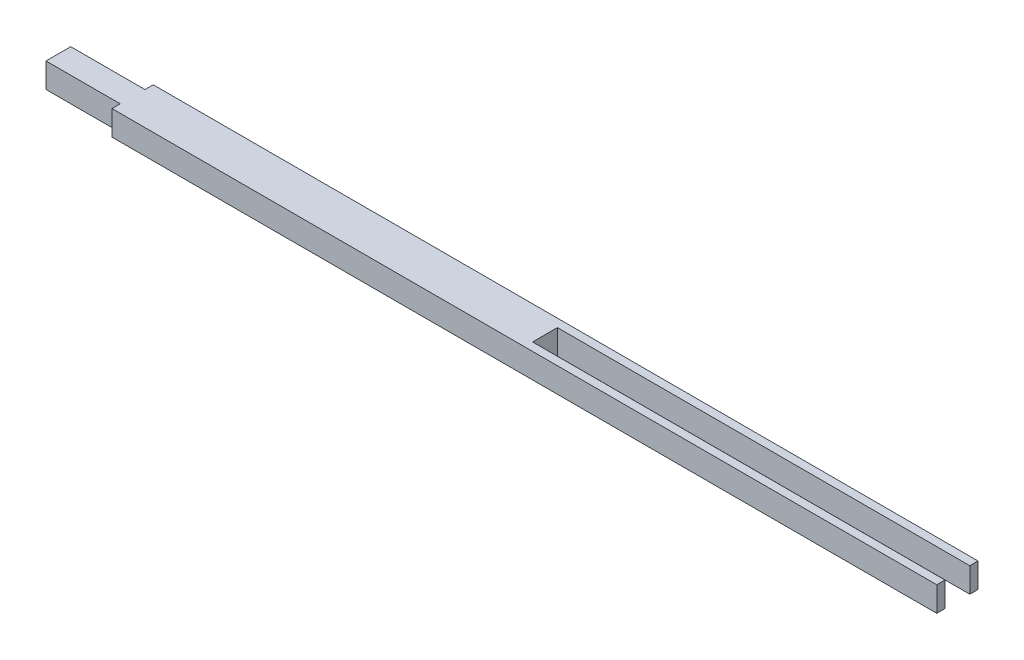
ISO-10303-21;
HEADER;
FILE_DESCRIPTION(('STEP AP214'),'2;1');
FILE_NAME('part.step','',(''),(''),'','','');
FILE_SCHEMA(('AUTOMOTIVE_DESIGN { 1 0 10303 214 1 1 1 1 }'));
ENDSEC;
DATA;
#1=APPLICATION_CONTEXT('core data for automotive mechanical design processes');
#2=APPLICATION_PROTOCOL_DEFINITION('international standard','automotive_design',2000,#1);
#3=PRODUCT_CONTEXT('',#1,'mechanical');
#4=PRODUCT('Part','Part','',(#3));
#5=PRODUCT_RELATED_PRODUCT_CATEGORY('part','',(#4));
#6=PRODUCT_DEFINITION_FORMATION('','',#4);
#7=PRODUCT_DEFINITION_CONTEXT('part definition',#1,'design');
#8=PRODUCT_DEFINITION('design','',#6,#7);
#9=PRODUCT_DEFINITION_SHAPE('','',#8);
#10=(LENGTH_UNIT() NAMED_UNIT(*) SI_UNIT(.MILLI.,.METRE.));
#11=(NAMED_UNIT(*) PLANE_ANGLE_UNIT() SI_UNIT($,.RADIAN.));
#12=(NAMED_UNIT(*) SI_UNIT($,.STERADIAN.) SOLID_ANGLE_UNIT());
#13=UNCERTAINTY_MEASURE_WITH_UNIT(LENGTH_MEASURE(1.E-05),#10,'distance_accuracy_value','');
#14=(GEOMETRIC_REPRESENTATION_CONTEXT(3) GLOBAL_UNCERTAINTY_ASSIGNED_CONTEXT((#13)) GLOBAL_UNIT_ASSIGNED_CONTEXT((#10,
#11,#12)) REPRESENTATION_CONTEXT('',''));
#15=CARTESIAN_POINT('',(0.,0.,0.));
#16=DIRECTION('',(0.,0.,1.));
#17=DIRECTION('',(1.,0.,0.));
#18=AXIS2_PLACEMENT_3D('',#15,#16,#17);
#19=CARTESIAN_POINT('',(-50.,3.,2.5));
#20=DIRECTION('',(1.,0.,0.));
#21=DIRECTION('',(0.,0.,-1.));
#22=AXIS2_PLACEMENT_3D('',#19,#20,#21);
#23=PLANE('',#22);
#24=DIRECTION('',(0.,0.,1.));
#25=VECTOR('',#24,1.);
#26=CARTESIAN_POINT('',(-50.,3.,2.5));
#27=LINE('',#26,#25);
#28=CARTESIAN_POINT('',(-50.,3.,1.5));
#29=VERTEX_POINT('',#28);
#30=CARTESIAN_POINT('',(-50.,3.,2.5));
#31=VERTEX_POINT('',#30);
#32=EDGE_CURVE('E189',#29,#31,#27,.T.);
#33=ORIENTED_EDGE('',*,*,#32,.F.);
#34=DIRECTION('',(0.,-1.,0.));
#35=VECTOR('',#34,1.);
#36=CARTESIAN_POINT('',(-50.,3.,1.5));
#37=LINE('',#36,#35);
#38=CARTESIAN_POINT('',(-50.,0.,1.5));
#39=VERTEX_POINT('',#38);
#40=EDGE_CURVE('E155',#29,#39,#37,.T.);
#41=ORIENTED_EDGE('',*,*,#40,.T.);
#42=DIRECTION('',(0.,0.,1.));
#43=VECTOR('',#42,1.);
#44=CARTESIAN_POINT('',(-50.,0.,2.5));
#45=LINE('',#44,#43);
#46=CARTESIAN_POINT('',(-50.,0.,2.5));
#47=VERTEX_POINT('',#46);
#48=EDGE_CURVE('E201',#39,#47,#45,.T.);
#49=ORIENTED_EDGE('',*,*,#48,.T.);
#50=DIRECTION('',(0.,-1.,0.));
#51=VECTOR('',#50,1.);
#52=CARTESIAN_POINT('',(-50.,3.,2.5));
#53=LINE('',#52,#51);
#54=EDGE_CURVE('E208',#31,#47,#53,.T.);
#55=ORIENTED_EDGE('',*,*,#54,.F.);
#56=EDGE_LOOP('',(#33,#41,#49,#55));
#57=FACE_BOUND('',#56,.T.);
#58=ADVANCED_FACE('F33',(#57),#23,.F.);
#59=CARTESIAN_POINT('',(50.,3.,2.5));
#60=DIRECTION('',(-1.,0.,0.));
#61=DIRECTION('',(0.,0.,1.));
#62=AXIS2_PLACEMENT_3D('',#59,#60,#61);
#63=PLANE('',#62);
#64=DIRECTION('',(0.,0.,-1.));
#65=VECTOR('',#64,1.);
#66=CARTESIAN_POINT('',(50.,0.,2.5));
#67=LINE('',#66,#65);
#68=CARTESIAN_POINT('',(50.,0.,2.5));
#69=VERTEX_POINT('',#68);
#70=CARTESIAN_POINT('',(50.,0.,1.50499999999999));
#71=VERTEX_POINT('',#70);
#72=EDGE_CURVE('E196',#69,#71,#67,.T.);
#73=ORIENTED_EDGE('',*,*,#72,.T.);
#74=DIRECTION('',(0.,1.,0.));
#75=VECTOR('',#74,1.);
#76=CARTESIAN_POINT('',(50.,0.,1.50499999999999));
#77=LINE('',#76,#75);
#78=CARTESIAN_POINT('',(50.,3.,1.50499999999999));
#79=VERTEX_POINT('',#78);
#80=EDGE_CURVE('E174',#71,#79,#77,.T.);
#81=ORIENTED_EDGE('',*,*,#80,.T.);
#82=DIRECTION('',(0.,0.,-1.));
#83=VECTOR('',#82,1.);
#84=CARTESIAN_POINT('',(50.,3.,2.5));
#85=LINE('',#84,#83);
#86=CARTESIAN_POINT('',(50.,3.,2.5));
#87=VERTEX_POINT('',#86);
#88=EDGE_CURVE('E183',#87,#79,#85,.T.);
#89=ORIENTED_EDGE('',*,*,#88,.F.);
#90=DIRECTION('',(0.,-1.,0.));
#91=VECTOR('',#90,1.);
#92=CARTESIAN_POINT('',(50.,3.,2.5));
#93=LINE('',#92,#91);
#94=EDGE_CURVE('E195',#87,#69,#93,.T.);
#95=ORIENTED_EDGE('',*,*,#94,.T.);
#96=EDGE_LOOP('',(#73,#81,#89,#95));
#97=FACE_BOUND('',#96,.T.);
#98=ADVANCED_FACE('F236',(#97),#63,.F.);
#99=CARTESIAN_POINT('',(50.,3.,-1.50499999999999));
#100=VERTEX_POINT('',#99);
#101=CARTESIAN_POINT('',(50.,3.,-2.5));
#102=VERTEX_POINT('',#101);
#103=EDGE_CURVE('E187',#100,#102,#85,.T.);
#104=ORIENTED_EDGE('',*,*,#103,.F.);
#105=DIRECTION('',(0.,1.,0.));
#106=VECTOR('',#105,1.);
#107=CARTESIAN_POINT('',(50.,0.,-1.50499999999999));
#108=LINE('',#107,#106);
#109=CARTESIAN_POINT('',(50.,0.,-1.50499999999999));
#110=VERTEX_POINT('',#109);
#111=EDGE_CURVE('E167',#110,#100,#108,.T.);
#112=ORIENTED_EDGE('',*,*,#111,.F.);
#113=CARTESIAN_POINT('',(50.,0.,-2.5));
#114=VERTEX_POINT('',#113);
#115=EDGE_CURVE('E177',#110,#114,#67,.T.);
#116=ORIENTED_EDGE('',*,*,#115,.T.);
#117=DIRECTION('',(0.,-1.,0.));
#118=VECTOR('',#117,1.);
#119=CARTESIAN_POINT('',(50.,3.,-2.5));
#120=LINE('',#119,#118);
#121=EDGE_CURVE('E11',#102,#114,#120,.T.);
#122=ORIENTED_EDGE('',*,*,#121,.F.);
#123=EDGE_LOOP('',(#104,#112,#116,#122));
#124=FACE_BOUND('',#123,.T.);
#125=ADVANCED_FACE('F35',(#124),#63,.F.);
#126=CARTESIAN_POINT('',(-50.,3.,-2.5));
#127=DIRECTION('',(0.,0.,1.));
#128=DIRECTION('',(1.,0.,0.));
#129=AXIS2_PLACEMENT_3D('',#126,#127,#128);
#130=PLANE('',#129);
#131=DIRECTION('',(-1.,0.,0.));
#132=VECTOR('',#131,1.);
#133=CARTESIAN_POINT('',(-50.,0.,-2.5));
#134=LINE('',#133,#132);
#135=CARTESIAN_POINT('',(-50.,0.,-2.5));
#136=VERTEX_POINT('',#135);
#137=EDGE_CURVE('E199',#114,#136,#134,.T.);
#138=ORIENTED_EDGE('',*,*,#137,.T.);
#139=DIRECTION('',(0.,-1.,0.));
#140=VECTOR('',#139,1.);
#141=CARTESIAN_POINT('',(-50.,3.,-2.5));
#142=LINE('',#141,#140);
#143=CARTESIAN_POINT('',(-50.,3.,-2.5));
#144=VERTEX_POINT('',#143);
#145=EDGE_CURVE('E41',#144,#136,#142,.T.);
#146=ORIENTED_EDGE('',*,*,#145,.F.);
#147=DIRECTION('',(-1.,0.,0.));
#148=VECTOR('',#147,1.);
#149=CARTESIAN_POINT('',(-50.,3.,-2.5));
#150=LINE('',#149,#148);
#151=EDGE_CURVE('E186',#102,#144,#150,.T.);
#152=ORIENTED_EDGE('',*,*,#151,.F.);
#153=ORIENTED_EDGE('',*,*,#121,.T.);
#154=EDGE_LOOP('',(#138,#146,#152,#153));
#155=FACE_BOUND('',#154,.T.);
#156=ADVANCED_FACE('F220',(#155),#130,.F.);
#157=CARTESIAN_POINT('',(-50.,0.,-1.5));
#158=VERTEX_POINT('',#157);
#159=EDGE_CURVE('E202',#136,#158,#45,.T.);
#160=ORIENTED_EDGE('',*,*,#159,.T.);
#161=DIRECTION('',(0.,1.,0.));
#162=VECTOR('',#161,1.);
#163=CARTESIAN_POINT('',(-50.,3.,-1.5));
#164=LINE('',#163,#162);
#165=CARTESIAN_POINT('',(-50.,3.,-1.5));
#166=VERTEX_POINT('',#165);
#167=EDGE_CURVE('E129',#158,#166,#164,.T.);
#168=ORIENTED_EDGE('',*,*,#167,.T.);
#169=EDGE_CURVE('E190',#144,#166,#27,.T.);
#170=ORIENTED_EDGE('',*,*,#169,.F.);
#171=ORIENTED_EDGE('',*,*,#145,.T.);
#172=EDGE_LOOP('',(#160,#168,#170,#171));
#173=FACE_BOUND('',#172,.T.);
#174=ADVANCED_FACE('F214',(#173),#23,.F.);
#175=CARTESIAN_POINT('',(-50.,3.,2.5));
#176=DIRECTION('',(0.,0.,-1.));
#177=DIRECTION('',(-1.,0.,0.));
#178=AXIS2_PLACEMENT_3D('',#175,#176,#177);
#179=PLANE('',#178);
#180=DIRECTION('',(1.,0.,0.));
#181=VECTOR('',#180,1.);
#182=CARTESIAN_POINT('',(-50.,0.,2.5));
#183=LINE('',#182,#181);
#184=EDGE_CURVE('E204',#47,#69,#183,.T.);
#185=ORIENTED_EDGE('',*,*,#184,.T.);
#186=ORIENTED_EDGE('',*,*,#94,.F.);
#187=DIRECTION('',(1.,0.,0.));
#188=VECTOR('',#187,1.);
#189=CARTESIAN_POINT('',(-50.,3.,2.5));
#190=LINE('',#189,#188);
#191=EDGE_CURVE('E193',#31,#87,#190,.T.);
#192=ORIENTED_EDGE('',*,*,#191,.F.);
#193=ORIENTED_EDGE('',*,*,#54,.T.);
#194=EDGE_LOOP('',(#185,#186,#192,#193));
#195=FACE_BOUND('',#194,.T.);
#196=ADVANCED_FACE('F241',(#195),#179,.F.);
#197=CARTESIAN_POINT('',(0.,3.,0.));
#198=DIRECTION('',(0.,-1.,0.));
#199=DIRECTION('',(0.,0.,-1.));
#200=AXIS2_PLACEMENT_3D('',#197,#198,#199);
#201=PLANE('',#200);
#202=ORIENTED_EDGE('',*,*,#169,.T.);
#203=DIRECTION('',(-1.,0.,0.));
#204=VECTOR('',#203,1.);
#205=CARTESIAN_POINT('',(-59.,3.,-1.5));
#206=LINE('',#205,#204);
#207=CARTESIAN_POINT('',(-59.,3.,-1.5));
#208=VERTEX_POINT('',#207);
#209=EDGE_CURVE('E149',#166,#208,#206,.T.);
#210=ORIENTED_EDGE('',*,*,#209,.T.);
#211=DIRECTION('',(0.,0.,1.));
#212=VECTOR('',#211,1.);
#213=CARTESIAN_POINT('',(-59.,3.,1.5));
#214=LINE('',#213,#212);
#215=CARTESIAN_POINT('',(-59.,3.,1.5));
#216=VERTEX_POINT('',#215);
#217=EDGE_CURVE('E140',#208,#216,#214,.T.);
#218=ORIENTED_EDGE('',*,*,#217,.T.);
#219=DIRECTION('',(1.,0.,0.));
#220=VECTOR('',#219,1.);
#221=CARTESIAN_POINT('',(-59.,3.,1.5));
#222=LINE('',#221,#220);
#223=EDGE_CURVE('E48',#216,#29,#222,.T.);
#224=ORIENTED_EDGE('',*,*,#223,.T.);
#225=ORIENTED_EDGE('',*,*,#32,.T.);
#226=ORIENTED_EDGE('',*,*,#191,.T.);
#227=ORIENTED_EDGE('',*,*,#88,.T.);
#228=DIRECTION('',(1.,0.,0.));
#229=VECTOR('',#228,1.);
#230=CARTESIAN_POINT('',(0.,3.,1.505));
#231=LINE('',#230,#229);
#232=CARTESIAN_POINT('',(0.,3.,1.505));
#233=VERTEX_POINT('',#232);
#234=EDGE_CURVE('E162',#233,#79,#231,.T.);
#235=ORIENTED_EDGE('',*,*,#234,.F.);
#236=DIRECTION('',(0.,0.,1.));
#237=VECTOR('',#236,1.);
#238=CARTESIAN_POINT('',(0.,3.,1.505));
#239=LINE('',#238,#237);
#240=CARTESIAN_POINT('',(0.,3.,-1.50499999999999));
#241=VERTEX_POINT('',#240);
#242=EDGE_CURVE('E170',#241,#233,#239,.T.);
#243=ORIENTED_EDGE('',*,*,#242,.F.);
#244=DIRECTION('',(-1.,0.,0.));
#245=VECTOR('',#244,1.);
#246=CARTESIAN_POINT('',(0.,3.,-1.50499999999999));
#247=LINE('',#246,#245);
#248=EDGE_CURVE('E158',#100,#241,#247,.T.);
#249=ORIENTED_EDGE('',*,*,#248,.F.);
#250=ORIENTED_EDGE('',*,*,#103,.T.);
#251=ORIENTED_EDGE('',*,*,#151,.T.);
#252=EDGE_LOOP('',(#202,#210,#218,#224,#225,#226,#227,#235,#243,#249,#250,#251));
#253=FACE_BOUND('',#252,.T.);
#254=ADVANCED_FACE('F228',(#253),#201,.F.);
#255=CARTESIAN_POINT('',(0.,0.,0.));
#256=DIRECTION('',(0.,-1.,0.));
#257=DIRECTION('',(0.,0.,-1.));
#258=AXIS2_PLACEMENT_3D('',#255,#256,#257);
#259=PLANE('',#258);
#260=ORIENTED_EDGE('',*,*,#48,.F.);
#261=DIRECTION('',(1.,0.,0.));
#262=VECTOR('',#261,1.);
#263=CARTESIAN_POINT('',(-59.,0.,1.5));
#264=LINE('',#263,#262);
#265=CARTESIAN_POINT('',(-59.,0.,1.5));
#266=VERTEX_POINT('',#265);
#267=EDGE_CURVE('E142',#266,#39,#264,.T.);
#268=ORIENTED_EDGE('',*,*,#267,.F.);
#269=DIRECTION('',(0.,0.,1.));
#270=VECTOR('',#269,1.);
#271=CARTESIAN_POINT('',(-59.,0.,1.5));
#272=LINE('',#271,#270);
#273=CARTESIAN_POINT('',(-59.,0.,-1.5));
#274=VERTEX_POINT('',#273);
#275=EDGE_CURVE('E134',#274,#266,#272,.T.);
#276=ORIENTED_EDGE('',*,*,#275,.F.);
#277=DIRECTION('',(-1.,0.,0.));
#278=VECTOR('',#277,1.);
#279=CARTESIAN_POINT('',(-59.,0.,-1.5));
#280=LINE('',#279,#278);
#281=EDGE_CURVE('E123',#158,#274,#280,.T.);
#282=ORIENTED_EDGE('',*,*,#281,.F.);
#283=ORIENTED_EDGE('',*,*,#159,.F.);
#284=ORIENTED_EDGE('',*,*,#137,.F.);
#285=ORIENTED_EDGE('',*,*,#115,.F.);
#286=DIRECTION('',(-1.,0.,0.));
#287=VECTOR('',#286,1.);
#288=CARTESIAN_POINT('',(0.,0.,-1.50499999999999));
#289=LINE('',#288,#287);
#290=CARTESIAN_POINT('',(0.,0.,-1.50499999999999));
#291=VERTEX_POINT('',#290);
#292=EDGE_CURVE('E159',#110,#291,#289,.T.);
#293=ORIENTED_EDGE('',*,*,#292,.T.);
#294=DIRECTION('',(0.,0.,1.));
#295=VECTOR('',#294,1.);
#296=CARTESIAN_POINT('',(0.,0.,1.505));
#297=LINE('',#296,#295);
#298=CARTESIAN_POINT('',(0.,0.,1.505));
#299=VERTEX_POINT('',#298);
#300=EDGE_CURVE('E56',#291,#299,#297,.T.);
#301=ORIENTED_EDGE('',*,*,#300,.T.);
#302=DIRECTION('',(1.,0.,0.));
#303=VECTOR('',#302,1.);
#304=CARTESIAN_POINT('',(0.,0.,1.505));
#305=LINE('',#304,#303);
#306=EDGE_CURVE('E164',#299,#71,#305,.T.);
#307=ORIENTED_EDGE('',*,*,#306,.T.);
#308=ORIENTED_EDGE('',*,*,#72,.F.);
#309=ORIENTED_EDGE('',*,*,#184,.F.);
#310=EDGE_LOOP('',(#260,#268,#276,#282,#283,#284,#285,#293,#301,#307,#308,#309));
#311=FACE_BOUND('',#310,.T.);
#312=ADVANCED_FACE('F145',(#311),#259,.T.);
#313=CARTESIAN_POINT('',(0.,0.,1.505));
#314=DIRECTION('',(0.,0.,1.));
#315=DIRECTION('',(1.,0.,0.));
#316=AXIS2_PLACEMENT_3D('',#313,#314,#315);
#317=PLANE('',#316);
#318=ORIENTED_EDGE('',*,*,#234,.T.);
#319=ORIENTED_EDGE('',*,*,#80,.F.);
#320=ORIENTED_EDGE('',*,*,#306,.F.);
#321=DIRECTION('',(0.,1.,0.));
#322=VECTOR('',#321,1.);
#323=CARTESIAN_POINT('',(0.,0.,1.505));
#324=LINE('',#323,#322);
#325=EDGE_CURVE('E178',#299,#233,#324,.T.);
#326=ORIENTED_EDGE('',*,*,#325,.T.);
#327=EDGE_LOOP('',(#318,#319,#320,#326));
#328=FACE_BOUND('',#327,.T.);
#329=ADVANCED_FACE('F315',(#328),#317,.F.);
#330=CARTESIAN_POINT('',(0.,0.,1.505));
#331=DIRECTION('',(-1.,0.,0.));
#332=DIRECTION('',(0.,0.,1.));
#333=AXIS2_PLACEMENT_3D('',#330,#331,#332);
#334=PLANE('',#333);
#335=ORIENTED_EDGE('',*,*,#242,.T.);
#336=ORIENTED_EDGE('',*,*,#325,.F.);
#337=ORIENTED_EDGE('',*,*,#300,.F.);
#338=DIRECTION('',(0.,1.,0.));
#339=VECTOR('',#338,1.);
#340=CARTESIAN_POINT('',(0.,0.,-1.50499999999999));
#341=LINE('',#340,#339);
#342=EDGE_CURVE('E180',#291,#241,#341,.T.);
#343=ORIENTED_EDGE('',*,*,#342,.T.);
#344=EDGE_LOOP('',(#335,#336,#337,#343));
#345=FACE_BOUND('',#344,.T.);
#346=ADVANCED_FACE('F230',(#345),#334,.F.);
#347=CARTESIAN_POINT('',(0.,0.,-1.50499999999999));
#348=DIRECTION('',(0.,0.,-1.));
#349=DIRECTION('',(-1.,0.,0.));
#350=AXIS2_PLACEMENT_3D('',#347,#348,#349);
#351=PLANE('',#350);
#352=ORIENTED_EDGE('',*,*,#248,.T.);
#353=ORIENTED_EDGE('',*,*,#342,.F.);
#354=ORIENTED_EDGE('',*,*,#292,.F.);
#355=ORIENTED_EDGE('',*,*,#111,.T.);
#356=EDGE_LOOP('',(#352,#353,#354,#355));
#357=FACE_BOUND('',#356,.T.);
#358=ADVANCED_FACE('F226',(#357),#351,.F.);
#359=CARTESIAN_POINT('',(-59.,0.,1.5));
#360=DIRECTION('',(0.,0.,1.));
#361=DIRECTION('',(1.,0.,0.));
#362=AXIS2_PLACEMENT_3D('',#359,#360,#361);
#363=PLANE('',#362);
#364=ORIENTED_EDGE('',*,*,#40,.F.);
#365=ORIENTED_EDGE('',*,*,#223,.F.);
#366=DIRECTION('',(0.,1.,0.));
#367=VECTOR('',#366,1.);
#368=CARTESIAN_POINT('',(-59.,0.,1.5));
#369=LINE('',#368,#367);
#370=EDGE_CURVE('E141',#266,#216,#369,.T.);
#371=ORIENTED_EDGE('',*,*,#370,.F.);
#372=ORIENTED_EDGE('',*,*,#267,.T.);
#373=EDGE_LOOP('',(#364,#365,#371,#372));
#374=FACE_BOUND('',#373,.T.);
#375=ADVANCED_FACE('F246',(#374),#363,.T.);
#376=CARTESIAN_POINT('',(-59.,0.,-1.5));
#377=DIRECTION('',(0.,0.,-1.));
#378=DIRECTION('',(-1.,0.,0.));
#379=AXIS2_PLACEMENT_3D('',#376,#377,#378);
#380=PLANE('',#379);
#381=ORIENTED_EDGE('',*,*,#167,.F.);
#382=ORIENTED_EDGE('',*,*,#281,.T.);
#383=DIRECTION('',(0.,1.,0.));
#384=VECTOR('',#383,1.);
#385=CARTESIAN_POINT('',(-59.,0.,-1.5));
#386=LINE('',#385,#384);
#387=EDGE_CURVE('E126',#274,#208,#386,.T.);
#388=ORIENTED_EDGE('',*,*,#387,.T.);
#389=ORIENTED_EDGE('',*,*,#209,.F.);
#390=EDGE_LOOP('',(#381,#382,#388,#389));
#391=FACE_BOUND('',#390,.T.);
#392=ADVANCED_FACE('F125',(#391),#380,.T.);
#393=CARTESIAN_POINT('',(-59.,0.,1.5));
#394=DIRECTION('',(-1.,0.,0.));
#395=DIRECTION('',(0.,0.,1.));
#396=AXIS2_PLACEMENT_3D('',#393,#394,#395);
#397=PLANE('',#396);
#398=ORIENTED_EDGE('',*,*,#217,.F.);
#399=ORIENTED_EDGE('',*,*,#387,.F.);
#400=ORIENTED_EDGE('',*,*,#275,.T.);
#401=ORIENTED_EDGE('',*,*,#370,.T.);
#402=EDGE_LOOP('',(#398,#399,#400,#401));
#403=FACE_BOUND('',#402,.T.);
#404=ADVANCED_FACE('F138',(#403),#397,.T.);
#405=CLOSED_SHELL('',(#58,#98,#125,#156,#174,#196,#254,#312,#329,#346,#358,#375,#392,#404));
#406=MANIFOLD_SOLID_BREP('B2',#405);
#407=ADVANCED_BREP_SHAPE_REPRESENTATION('',(#18,#406),#14);
#408=SHAPE_DEFINITION_REPRESENTATION(#9,#407);
ENDSEC;
END-ISO-10303-21;
